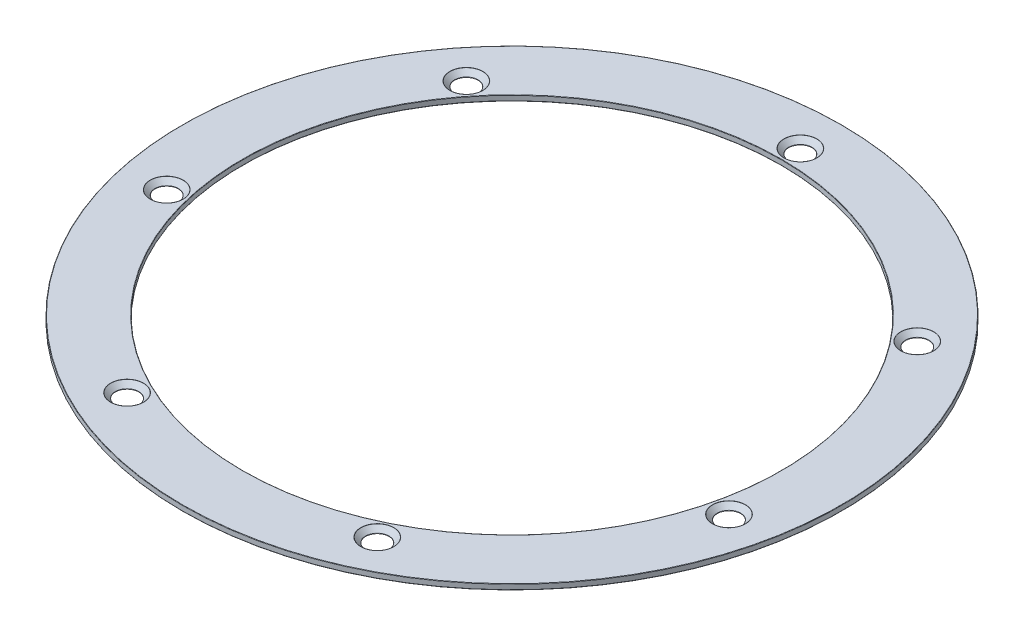
ISO-10303-21;
HEADER;
FILE_DESCRIPTION(('STEP AP214'),'2;1');
FILE_NAME('part.step','',(''),(''),'','','');
FILE_SCHEMA(('AUTOMOTIVE_DESIGN { 1 0 10303 214 1 1 1 1 }'));
ENDSEC;
DATA;
#1=APPLICATION_CONTEXT('core data for automotive mechanical design processes');
#2=APPLICATION_PROTOCOL_DEFINITION('international standard','automotive_design',2000,#1);
#3=PRODUCT_CONTEXT('',#1,'mechanical');
#4=PRODUCT('Part','Part','',(#3));
#5=PRODUCT_RELATED_PRODUCT_CATEGORY('part','',(#4));
#6=PRODUCT_DEFINITION_FORMATION('','',#4);
#7=PRODUCT_DEFINITION_CONTEXT('part definition',#1,'design');
#8=PRODUCT_DEFINITION('design','',#6,#7);
#9=PRODUCT_DEFINITION_SHAPE('','',#8);
#10=(LENGTH_UNIT() NAMED_UNIT(*) SI_UNIT(.MILLI.,.METRE.));
#11=(NAMED_UNIT(*) PLANE_ANGLE_UNIT() SI_UNIT($,.RADIAN.));
#12=(NAMED_UNIT(*) SI_UNIT($,.STERADIAN.) SOLID_ANGLE_UNIT());
#13=UNCERTAINTY_MEASURE_WITH_UNIT(LENGTH_MEASURE(1.E-05),#10,'distance_accuracy_value','');
#14=(GEOMETRIC_REPRESENTATION_CONTEXT(3) GLOBAL_UNCERTAINTY_ASSIGNED_CONTEXT((#13)) GLOBAL_UNIT_ASSIGNED_CONTEXT((#10,
#11,#12)) REPRESENTATION_CONTEXT('',''));
#15=CARTESIAN_POINT('',(0.,0.,0.));
#16=DIRECTION('',(0.,0.,1.));
#17=DIRECTION('',(1.,0.,0.));
#18=AXIS2_PLACEMENT_3D('',#15,#16,#17);
#19=CARTESIAN_POINT('',(0.,0.,0.));
#20=DIRECTION('',(0.,1.,0.));
#21=DIRECTION('',(0.,0.,1.));
#22=AXIS2_PLACEMENT_3D('',#19,#20,#21);
#23=PLANE('',#22);
#24=CARTESIAN_POINT('',(0.,0.,0.));
#25=DIRECTION('',(0.,1.,0.));
#26=DIRECTION('',(0.,0.,1.));
#27=AXIS2_PLACEMENT_3D('',#24,#25,#26);
#28=CIRCLE('',#27,75.3);
#29=CARTESIAN_POINT('',(0.,0.,75.3));
#30=VERTEX_POINT('',#29);
#31=EDGE_CURVE('E169',#30,#30,#28,.T.);
#32=ORIENTED_EDGE('',*,*,#31,.T.);
#33=EDGE_LOOP('',(#32));
#34=FACE_BOUND('',#33,.T.);
#35=CARTESIAN_POINT('',(0.,0.,0.));
#36=DIRECTION('',(0.,1.,0.));
#37=DIRECTION('',(0.,0.,1.));
#38=AXIS2_PLACEMENT_3D('',#35,#36,#37);
#39=CIRCLE('',#38,91.9);
#40=CARTESIAN_POINT('',(0.,0.,91.9));
#41=VERTEX_POINT('',#40);
#42=EDGE_CURVE('E173',#41,#41,#39,.F.);
#43=ORIENTED_EDGE('',*,*,#42,.T.);
#44=EDGE_LOOP('',(#43));
#45=FACE_BOUND('',#44,.T.);
#46=CARTESIAN_POINT('',(0.,0.,-80.5));
#47=DIRECTION('',(0.,1.,0.));
#48=DIRECTION('',(0.,0.,1.));
#49=AXIS2_PLACEMENT_3D('',#46,#47,#48);
#50=CIRCLE('',#49,3.33142135623731);
#51=CARTESIAN_POINT('',(0.,0.,-77.1685786437627));
#52=VERTEX_POINT('',#51);
#53=EDGE_CURVE('E177',#52,#52,#50,.T.);
#54=ORIENTED_EDGE('',*,*,#53,.T.);
#55=EDGE_LOOP('',(#54));
#56=FACE_BOUND('',#55,.T.);
#57=CARTESIAN_POINT('',(-62.9374343386765,0.,-50.1909290496279));
#58=DIRECTION('',(0.,1.,0.));
#59=DIRECTION('',(0.,0.,1.));
#60=AXIS2_PLACEMENT_3D('',#57,#58,#59);
#61=CIRCLE('',#60,3.33142135623731);
#62=CARTESIAN_POINT('',(-62.9374343386765,0.,-46.8595076933906));
#63=VERTEX_POINT('',#62);
#64=EDGE_CURVE('E181',#63,#63,#61,.T.);
#65=ORIENTED_EDGE('',*,*,#64,.T.);
#66=EDGE_LOOP('',(#65));
#67=FACE_BOUND('',#66,.T.);
#68=CARTESIAN_POINT('',(-78.4816969306367,0.,17.9129351834836));
#69=DIRECTION('',(0.,1.,0.));
#70=DIRECTION('',(0.,0.,1.));
#71=AXIS2_PLACEMENT_3D('',#68,#69,#70);
#72=CIRCLE('',#71,3.33142135623731);
#73=CARTESIAN_POINT('',(-78.4816969306367,0.,21.2443565397209));
#74=VERTEX_POINT('',#73);
#75=EDGE_CURVE('E185',#74,#74,#72,.T.);
#76=ORIENTED_EDGE('',*,*,#75,.T.);
#77=EDGE_LOOP('',(#76));
#78=FACE_BOUND('',#77,.T.);
#79=CARTESIAN_POINT('',(-34.927640998963,0.,72.527993866145));
#80=DIRECTION('',(0.,1.,0.));
#81=DIRECTION('',(0.,0.,1.));
#82=AXIS2_PLACEMENT_3D('',#79,#80,#81);
#83=CIRCLE('',#82,3.33142135623731);
#84=CARTESIAN_POINT('',(-34.927640998963,0.,75.8594152223823));
#85=VERTEX_POINT('',#84);
#86=EDGE_CURVE('E189',#85,#85,#83,.T.);
#87=ORIENTED_EDGE('',*,*,#86,.T.);
#88=EDGE_LOOP('',(#87));
#89=FACE_BOUND('',#88,.T.);
#90=CARTESIAN_POINT('',(34.927640998964,0.,72.5279938661445));
#91=DIRECTION('',(0.,1.,0.));
#92=DIRECTION('',(0.,0.,1.));
#93=AXIS2_PLACEMENT_3D('',#90,#91,#92);
#94=CIRCLE('',#93,3.33142135623731);
#95=CARTESIAN_POINT('',(34.927640998964,0.,75.8594152223818));
#96=VERTEX_POINT('',#95);
#97=EDGE_CURVE('E193',#96,#96,#94,.T.);
#98=ORIENTED_EDGE('',*,*,#97,.T.);
#99=EDGE_LOOP('',(#98));
#100=FACE_BOUND('',#99,.T.);
#101=CARTESIAN_POINT('',(78.481696930637,0.,17.9129351834826));
#102=DIRECTION('',(0.,1.,0.));
#103=DIRECTION('',(0.,0.,1.));
#104=AXIS2_PLACEMENT_3D('',#101,#102,#103);
#105=CIRCLE('',#104,3.33142135623731);
#106=CARTESIAN_POINT('',(78.481696930637,0.,21.2443565397199));
#107=VERTEX_POINT('',#106);
#108=EDGE_CURVE('E197',#107,#107,#105,.T.);
#109=ORIENTED_EDGE('',*,*,#108,.T.);
#110=EDGE_LOOP('',(#109));
#111=FACE_BOUND('',#110,.T.);
#112=CARTESIAN_POINT('',(62.9374343386758,0.,-50.1909290496288));
#113=DIRECTION('',(0.,1.,0.));
#114=DIRECTION('',(0.,0.,1.));
#115=AXIS2_PLACEMENT_3D('',#112,#113,#114);
#116=CIRCLE('',#115,3.33142135623731);
#117=CARTESIAN_POINT('',(62.9374343386758,0.,-46.8595076933915));
#118=VERTEX_POINT('',#117);
#119=EDGE_CURVE('E201',#118,#118,#116,.T.);
#120=ORIENTED_EDGE('',*,*,#119,.T.);
#121=EDGE_LOOP('',(#120));
#122=FACE_BOUND('',#121,.T.);
#123=ADVANCED_FACE('F51',(#34,#45,#56,#67,#78,#89,#100,#111,#122),#23,.F.);
#124=CARTESIAN_POINT('',(0.,1.5,0.));
#125=DIRECTION('',(0.,1.,0.));
#126=DIRECTION('',(0.,0.,1.));
#127=AXIS2_PLACEMENT_3D('',#124,#125,#126);
#128=PLANE('',#127);
#129=CARTESIAN_POINT('',(0.,1.5,0.));
#130=DIRECTION('',(0.,1.,0.));
#131=DIRECTION('',(0.,0.,1.));
#132=AXIS2_PLACEMENT_3D('',#129,#130,#131);
#133=CIRCLE('',#132,75.3);
#134=CARTESIAN_POINT('',(0.,1.5,75.3));
#135=VERTEX_POINT('',#134);
#136=EDGE_CURVE('E10',#135,#135,#133,.F.);
#137=ORIENTED_EDGE('',*,*,#136,.T.);
#138=EDGE_LOOP('',(#137));
#139=FACE_BOUND('',#138,.T.);
#140=CARTESIAN_POINT('',(0.,1.5,0.));
#141=DIRECTION('',(0.,1.,0.));
#142=DIRECTION('',(0.,0.,1.));
#143=AXIS2_PLACEMENT_3D('',#140,#141,#142);
#144=CIRCLE('',#143,91.9);
#145=CARTESIAN_POINT('',(0.,1.5,91.9));
#146=VERTEX_POINT('',#145);
#147=EDGE_CURVE('E59',#146,#146,#144,.T.);
#148=ORIENTED_EDGE('',*,*,#147,.T.);
#149=EDGE_LOOP('',(#148));
#150=FACE_BOUND('',#149,.T.);
#151=CARTESIAN_POINT('',(0.,1.5,-80.5));
#152=DIRECTION('',(0.,1.,0.));
#153=DIRECTION('',(0.,0.,1.));
#154=AXIS2_PLACEMENT_3D('',#151,#152,#153);
#155=CIRCLE('',#154,4.63142135623731);
#156=CARTESIAN_POINT('',(0.,1.5,-75.8685786437627));
#157=VERTEX_POINT('',#156);
#158=EDGE_CURVE('E65',#157,#157,#155,.F.);
#159=ORIENTED_EDGE('',*,*,#158,.T.);
#160=EDGE_LOOP('',(#159));
#161=FACE_BOUND('',#160,.T.);
#162=CARTESIAN_POINT('',(-62.9374343386765,1.5,-50.1909290496279));
#163=DIRECTION('',(0.,1.,0.));
#164=DIRECTION('',(0.,0.,1.));
#165=AXIS2_PLACEMENT_3D('',#162,#163,#164);
#166=CIRCLE('',#165,4.63142135623731);
#167=CARTESIAN_POINT('',(-62.9374343386765,1.5,-45.5595076933906));
#168=VERTEX_POINT('',#167);
#169=EDGE_CURVE('E71',#168,#168,#166,.F.);
#170=ORIENTED_EDGE('',*,*,#169,.T.);
#171=EDGE_LOOP('',(#170));
#172=FACE_BOUND('',#171,.T.);
#173=CARTESIAN_POINT('',(-78.4816969306367,1.5,17.9129351834836));
#174=DIRECTION('',(0.,1.,0.));
#175=DIRECTION('',(0.,0.,1.));
#176=AXIS2_PLACEMENT_3D('',#173,#174,#175);
#177=CIRCLE('',#176,4.63142135623731);
#178=CARTESIAN_POINT('',(-78.4816969306367,1.5,22.5443565397209));
#179=VERTEX_POINT('',#178);
#180=EDGE_CURVE('E77',#179,#179,#177,.F.);
#181=ORIENTED_EDGE('',*,*,#180,.T.);
#182=EDGE_LOOP('',(#181));
#183=FACE_BOUND('',#182,.T.);
#184=CARTESIAN_POINT('',(-34.927640998963,1.5,72.527993866145));
#185=DIRECTION('',(0.,1.,0.));
#186=DIRECTION('',(0.,0.,1.));
#187=AXIS2_PLACEMENT_3D('',#184,#185,#186);
#188=CIRCLE('',#187,4.63142135623731);
#189=CARTESIAN_POINT('',(-34.927640998963,1.5,77.1594152223823));
#190=VERTEX_POINT('',#189);
#191=EDGE_CURVE('E81',#190,#190,#188,.F.);
#192=ORIENTED_EDGE('',*,*,#191,.T.);
#193=EDGE_LOOP('',(#192));
#194=FACE_BOUND('',#193,.T.);
#195=CARTESIAN_POINT('',(34.927640998964,1.5,72.5279938661445));
#196=DIRECTION('',(0.,1.,0.));
#197=DIRECTION('',(0.,0.,1.));
#198=AXIS2_PLACEMENT_3D('',#195,#196,#197);
#199=CIRCLE('',#198,4.63142135623731);
#200=CARTESIAN_POINT('',(34.927640998964,1.5,77.1594152223818));
#201=VERTEX_POINT('',#200);
#202=EDGE_CURVE('E85',#201,#201,#199,.F.);
#203=ORIENTED_EDGE('',*,*,#202,.T.);
#204=EDGE_LOOP('',(#203));
#205=FACE_BOUND('',#204,.T.);
#206=CARTESIAN_POINT('',(78.481696930637,1.5,17.9129351834826));
#207=DIRECTION('',(0.,1.,0.));
#208=DIRECTION('',(0.,0.,1.));
#209=AXIS2_PLACEMENT_3D('',#206,#207,#208);
#210=CIRCLE('',#209,4.63142135623731);
#211=CARTESIAN_POINT('',(78.481696930637,1.5,22.5443565397199));
#212=VERTEX_POINT('',#211);
#213=EDGE_CURVE('E89',#212,#212,#210,.F.);
#214=ORIENTED_EDGE('',*,*,#213,.T.);
#215=EDGE_LOOP('',(#214));
#216=FACE_BOUND('',#215,.T.);
#217=CARTESIAN_POINT('',(62.9374343386758,1.5,-50.1909290496288));
#218=DIRECTION('',(0.,1.,0.));
#219=DIRECTION('',(0.,0.,1.));
#220=AXIS2_PLACEMENT_3D('',#217,#218,#219);
#221=CIRCLE('',#220,4.63142135623731);
#222=CARTESIAN_POINT('',(62.9374343386758,1.5,-45.5595076933915));
#223=VERTEX_POINT('',#222);
#224=EDGE_CURVE('E93',#223,#223,#221,.F.);
#225=ORIENTED_EDGE('',*,*,#224,.T.);
#226=EDGE_LOOP('',(#225));
#227=FACE_BOUND('',#226,.T.);
#228=ADVANCED_FACE('F226',(#139,#150,#161,#172,#183,#194,#205,#216,#227),#128,.T.);
#229=CARTESIAN_POINT('',(0.,1.5,0.));
#230=DIRECTION('',(0.,-1.,0.));
#231=DIRECTION('',(0.,0.,-1.));
#232=AXIS2_PLACEMENT_3D('',#229,#230,#231);
#233=CYLINDRICAL_SURFACE('',#232,92.);
#234=CARTESIAN_POINT('',(0.,0.1,0.));
#235=DIRECTION('',(0.,1.,0.));
#236=DIRECTION('',(0.,0.,1.));
#237=AXIS2_PLACEMENT_3D('',#234,#235,#236);
#238=CIRCLE('',#237,92.);
#239=CARTESIAN_POINT('',(0.,0.1,92.));
#240=VERTEX_POINT('',#239);
#241=EDGE_CURVE('E153',#240,#240,#238,.T.);
#242=ORIENTED_EDGE('',*,*,#241,.T.);
#243=EDGE_LOOP('',(#242));
#244=FACE_BOUND('',#243,.T.);
#245=CARTESIAN_POINT('',(0.,1.4,0.));
#246=DIRECTION('',(0.,1.,0.));
#247=DIRECTION('',(0.,0.,1.));
#248=AXIS2_PLACEMENT_3D('',#245,#246,#247);
#249=CIRCLE('',#248,92.);
#250=CARTESIAN_POINT('',(0.,1.4,92.));
#251=VERTEX_POINT('',#250);
#252=EDGE_CURVE('E157',#251,#251,#249,.F.);
#253=ORIENTED_EDGE('',*,*,#252,.T.);
#254=EDGE_LOOP('',(#253));
#255=FACE_BOUND('',#254,.T.);
#256=ADVANCED_FACE('F232',(#244,#255),#233,.T.);
#257=CARTESIAN_POINT('',(0.,1.5,0.));
#258=DIRECTION('',(0.,-1.,0.));
#259=DIRECTION('',(0.,0.,-1.));
#260=AXIS2_PLACEMENT_3D('',#257,#258,#259);
#261=CYLINDRICAL_SURFACE('',#260,75.2);
#262=CARTESIAN_POINT('',(0.,0.1,0.));
#263=DIRECTION('',(0.,1.,0.));
#264=DIRECTION('',(0.,0.,1.));
#265=AXIS2_PLACEMENT_3D('',#262,#263,#264);
#266=CIRCLE('',#265,75.2);
#267=CARTESIAN_POINT('',(0.,0.1,75.2));
#268=VERTEX_POINT('',#267);
#269=EDGE_CURVE('E161',#268,#268,#266,.F.);
#270=ORIENTED_EDGE('',*,*,#269,.T.);
#271=EDGE_LOOP('',(#270));
#272=FACE_BOUND('',#271,.T.);
#273=CARTESIAN_POINT('',(0.,1.4,0.));
#274=DIRECTION('',(0.,1.,0.));
#275=DIRECTION('',(0.,0.,1.));
#276=AXIS2_PLACEMENT_3D('',#273,#274,#275);
#277=CIRCLE('',#276,75.2);
#278=CARTESIAN_POINT('',(0.,1.4,75.2));
#279=VERTEX_POINT('',#278);
#280=EDGE_CURVE('E165',#279,#279,#277,.T.);
#281=ORIENTED_EDGE('',*,*,#280,.T.);
#282=EDGE_LOOP('',(#281));
#283=FACE_BOUND('',#282,.T.);
#284=ADVANCED_FACE('F239',(#272,#283),#261,.F.);
#285=CARTESIAN_POINT('',(0.,1.5,-80.5));
#286=DIRECTION('',(0.,1.,0.));
#287=DIRECTION('',(0.,0.,1.));
#288=AXIS2_PLACEMENT_3D('',#285,#286,#287);
#289=CONICAL_SURFACE('',#288,4.59,0.785398163397449);
#290=CARTESIAN_POINT('',(0.,0.170710678118655,-80.5));
#291=DIRECTION('',(0.,-1.,0.));
#292=DIRECTION('',(0.,0.,-1.));
#293=AXIS2_PLACEMENT_3D('',#290,#291,#292);
#294=CIRCLE('',#293,3.26071067811865);
#295=CARTESIAN_POINT('',(0.,0.170710678118655,-83.7607106781187));
#296=VERTEX_POINT('',#295);
#297=EDGE_CURVE('E145',#296,#296,#294,.T.);
#298=ORIENTED_EDGE('',*,*,#297,.T.);
#299=EDGE_LOOP('',(#298));
#300=FACE_BOUND('',#299,.T.);
#301=CARTESIAN_POINT('',(0.,1.47071067811865,-80.5));
#302=DIRECTION('',(0.,1.,0.));
#303=DIRECTION('',(0.,0.,1.));
#304=AXIS2_PLACEMENT_3D('',#301,#302,#303);
#305=CIRCLE('',#304,4.56071067811865);
#306=CARTESIAN_POINT('',(0.,1.47071067811865,-75.9392893218813));
#307=VERTEX_POINT('',#306);
#308=EDGE_CURVE('E149',#307,#307,#305,.T.);
#309=ORIENTED_EDGE('',*,*,#308,.T.);
#310=EDGE_LOOP('',(#309));
#311=FACE_BOUND('',#310,.T.);
#312=ADVANCED_FACE('F381',(#300,#311),#289,.F.);
#313=CARTESIAN_POINT('',(-62.9374343386765,1.5,-50.1909290496279));
#314=DIRECTION('',(0.,1.,0.));
#315=DIRECTION('',(0.781831482468031,0.,0.623489801858732));
#316=AXIS2_PLACEMENT_3D('',#313,#314,#315);
#317=CONICAL_SURFACE('',#316,4.59,0.785398163397449);
#318=CARTESIAN_POINT('',(-62.9374343386765,0.170710678118655,-50.1909290496279));
#319=DIRECTION('',(0.,-1.,0.));
#320=DIRECTION('',(0.,0.,-1.));
#321=AXIS2_PLACEMENT_3D('',#318,#319,#320);
#322=CIRCLE('',#321,3.26071067811865);
#323=CARTESIAN_POINT('',(-62.9374343386765,0.170710678118655,-53.4516397277466));
#324=VERTEX_POINT('',#323);
#325=EDGE_CURVE('E137',#324,#324,#322,.T.);
#326=ORIENTED_EDGE('',*,*,#325,.T.);
#327=EDGE_LOOP('',(#326));
#328=FACE_BOUND('',#327,.T.);
#329=CARTESIAN_POINT('',(-62.9374343386765,1.47071067811865,-50.1909290496279));
#330=DIRECTION('',(0.,1.,0.));
#331=DIRECTION('',(0.,0.,1.));
#332=AXIS2_PLACEMENT_3D('',#329,#330,#331);
#333=CIRCLE('',#332,4.56071067811865);
#334=CARTESIAN_POINT('',(-62.9374343386765,1.47071067811865,-45.6302183715093));
#335=VERTEX_POINT('',#334);
#336=EDGE_CURVE('E141',#335,#335,#333,.T.);
#337=ORIENTED_EDGE('',*,*,#336,.T.);
#338=EDGE_LOOP('',(#337));
#339=FACE_BOUND('',#338,.T.);
#340=ADVANCED_FACE('F377',(#328,#339),#317,.F.);
#341=CARTESIAN_POINT('',(-78.4816969306367,1.5,17.9129351834836));
#342=DIRECTION('',(0.,1.,0.));
#343=DIRECTION('',(0.974927912181823,0.,-0.222520933956318));
#344=AXIS2_PLACEMENT_3D('',#341,#342,#343);
#345=CONICAL_SURFACE('',#344,4.59,0.785398163397449);
#346=CARTESIAN_POINT('',(-78.4816969306367,0.170710678118655,17.9129351834836));
#347=DIRECTION('',(0.,-1.,0.));
#348=DIRECTION('',(0.,0.,-1.));
#349=AXIS2_PLACEMENT_3D('',#346,#347,#348);
#350=CIRCLE('',#349,3.26071067811865);
#351=CARTESIAN_POINT('',(-78.4816969306367,0.170710678118655,14.652224505365));
#352=VERTEX_POINT('',#351);
#353=EDGE_CURVE('E129',#352,#352,#350,.T.);
#354=ORIENTED_EDGE('',*,*,#353,.T.);
#355=EDGE_LOOP('',(#354));
#356=FACE_BOUND('',#355,.T.);
#357=CARTESIAN_POINT('',(-78.4816969306367,1.47071067811865,17.9129351834836));
#358=DIRECTION('',(0.,1.,0.));
#359=DIRECTION('',(0.,0.,1.));
#360=AXIS2_PLACEMENT_3D('',#357,#358,#359);
#361=CIRCLE('',#360,4.56071067811865);
#362=CARTESIAN_POINT('',(-78.4816969306367,1.47071067811865,22.4736458616023));
#363=VERTEX_POINT('',#362);
#364=EDGE_CURVE('E133',#363,#363,#361,.T.);
#365=ORIENTED_EDGE('',*,*,#364,.T.);
#366=EDGE_LOOP('',(#365));
#367=FACE_BOUND('',#366,.T.);
#368=ADVANCED_FACE('F380',(#356,#367),#345,.F.);
#369=CARTESIAN_POINT('',(-34.927640998963,1.5,72.527993866145));
#370=DIRECTION('',(0.,1.,0.));
#371=DIRECTION('',(0.433883739117553,0.,-0.900968867902422));
#372=AXIS2_PLACEMENT_3D('',#369,#370,#371);
#373=CONICAL_SURFACE('',#372,4.59,0.785398163397449);
#374=CARTESIAN_POINT('',(-34.927640998963,0.170710678118655,72.527993866145));
#375=DIRECTION('',(0.,-1.,0.));
#376=DIRECTION('',(0.,0.,-1.));
#377=AXIS2_PLACEMENT_3D('',#374,#375,#376);
#378=CIRCLE('',#377,3.26071067811865);
#379=CARTESIAN_POINT('',(-34.927640998963,0.170710678118655,69.2672831880263));
#380=VERTEX_POINT('',#379);
#381=EDGE_CURVE('E121',#380,#380,#378,.T.);
#382=ORIENTED_EDGE('',*,*,#381,.T.);
#383=EDGE_LOOP('',(#382));
#384=FACE_BOUND('',#383,.T.);
#385=CARTESIAN_POINT('',(-34.927640998963,1.47071067811865,72.527993866145));
#386=DIRECTION('',(0.,1.,0.));
#387=DIRECTION('',(0.,0.,1.));
#388=AXIS2_PLACEMENT_3D('',#385,#386,#387);
#389=CIRCLE('',#388,4.56071067811865);
#390=CARTESIAN_POINT('',(-34.927640998963,1.47071067811865,77.0887045442636));
#391=VERTEX_POINT('',#390);
#392=EDGE_CURVE('E125',#391,#391,#389,.T.);
#393=ORIENTED_EDGE('',*,*,#392,.T.);
#394=EDGE_LOOP('',(#393));
#395=FACE_BOUND('',#394,.T.);
#396=ADVANCED_FACE('F282',(#384,#395),#373,.F.);
#397=CARTESIAN_POINT('',(34.927640998964,1.5,72.5279938661445));
#398=DIRECTION('',(0.,1.,0.));
#399=DIRECTION('',(-0.433883739117565,0.,-0.900968867902416));
#400=AXIS2_PLACEMENT_3D('',#397,#398,#399);
#401=CONICAL_SURFACE('',#400,4.59,0.785398163397449);
#402=CARTESIAN_POINT('',(34.927640998964,0.170710678118655,72.5279938661445));
#403=DIRECTION('',(0.,-1.,0.));
#404=DIRECTION('',(0.,0.,-1.));
#405=AXIS2_PLACEMENT_3D('',#402,#403,#404);
#406=CIRCLE('',#405,3.26071067811865);
#407=CARTESIAN_POINT('',(34.927640998964,0.170710678118655,69.2672831880258));
#408=VERTEX_POINT('',#407);
#409=EDGE_CURVE('E113',#408,#408,#406,.T.);
#410=ORIENTED_EDGE('',*,*,#409,.T.);
#411=EDGE_LOOP('',(#410));
#412=FACE_BOUND('',#411,.T.);
#413=CARTESIAN_POINT('',(34.927640998964,1.47071067811865,72.5279938661445));
#414=DIRECTION('',(0.,1.,0.));
#415=DIRECTION('',(0.,0.,1.));
#416=AXIS2_PLACEMENT_3D('',#413,#414,#415);
#417=CIRCLE('',#416,4.56071067811865);
#418=CARTESIAN_POINT('',(34.927640998964,1.47071067811865,77.0887045442631));
#419=VERTEX_POINT('',#418);
#420=EDGE_CURVE('E117',#419,#419,#417,.T.);
#421=ORIENTED_EDGE('',*,*,#420,.T.);
#422=EDGE_LOOP('',(#421));
#423=FACE_BOUND('',#422,.T.);
#424=ADVANCED_FACE('F278',(#412,#423),#401,.F.);
#425=CARTESIAN_POINT('',(78.481696930637,1.5,17.9129351834826));
#426=DIRECTION('',(0.,1.,0.));
#427=DIRECTION('',(-0.974927912181826,0.,-0.222520933956305));
#428=AXIS2_PLACEMENT_3D('',#425,#426,#427);
#429=CONICAL_SURFACE('',#428,4.59,0.785398163397449);
#430=CARTESIAN_POINT('',(78.481696930637,0.170710678118655,17.9129351834826));
#431=DIRECTION('',(0.,-1.,0.));
#432=DIRECTION('',(0.,0.,-1.));
#433=AXIS2_PLACEMENT_3D('',#430,#431,#432);
#434=CIRCLE('',#433,3.26071067811865);
#435=CARTESIAN_POINT('',(78.481696930637,0.170710678118655,14.6522245053639));
#436=VERTEX_POINT('',#435);
#437=EDGE_CURVE('E105',#436,#436,#434,.T.);
#438=ORIENTED_EDGE('',*,*,#437,.T.);
#439=EDGE_LOOP('',(#438));
#440=FACE_BOUND('',#439,.T.);
#441=CARTESIAN_POINT('',(78.481696930637,1.47071067811865,17.9129351834826));
#442=DIRECTION('',(0.,1.,0.));
#443=DIRECTION('',(0.,0.,1.));
#444=AXIS2_PLACEMENT_3D('',#441,#442,#443);
#445=CIRCLE('',#444,4.56071067811865);
#446=CARTESIAN_POINT('',(78.481696930637,1.47071067811865,22.4736458616012));
#447=VERTEX_POINT('',#446);
#448=EDGE_CURVE('E109',#447,#447,#445,.T.);
#449=ORIENTED_EDGE('',*,*,#448,.T.);
#450=EDGE_LOOP('',(#449));
#451=FACE_BOUND('',#450,.T.);
#452=ADVANCED_FACE('F281',(#440,#451),#429,.F.);
#453=CARTESIAN_POINT('',(62.9374343386758,1.5,-50.1909290496288));
#454=DIRECTION('',(0.,1.,0.));
#455=DIRECTION('',(-0.781831482468022,0.,0.623489801858743));
#456=AXIS2_PLACEMENT_3D('',#453,#454,#455);
#457=CONICAL_SURFACE('',#456,4.59,0.785398163397449);
#458=CARTESIAN_POINT('',(62.9374343386758,0.170710678118655,-50.1909290496288));
#459=DIRECTION('',(0.,-1.,0.));
#460=DIRECTION('',(0.,0.,-1.));
#461=AXIS2_PLACEMENT_3D('',#458,#459,#460);
#462=CIRCLE('',#461,3.26071067811865);
#463=CARTESIAN_POINT('',(62.9374343386758,0.170710678118655,-53.4516397277475));
#464=VERTEX_POINT('',#463);
#465=EDGE_CURVE('E97',#464,#464,#462,.T.);
#466=ORIENTED_EDGE('',*,*,#465,.T.);
#467=EDGE_LOOP('',(#466));
#468=FACE_BOUND('',#467,.T.);
#469=CARTESIAN_POINT('',(62.9374343386758,1.47071067811865,-50.1909290496288));
#470=DIRECTION('',(0.,1.,0.));
#471=DIRECTION('',(0.,0.,1.));
#472=AXIS2_PLACEMENT_3D('',#469,#470,#471);
#473=CIRCLE('',#472,4.56071067811865);
#474=CARTESIAN_POINT('',(62.9374343386758,1.47071067811865,-45.6302183715102));
#475=VERTEX_POINT('',#474);
#476=EDGE_CURVE('E101',#475,#475,#473,.T.);
#477=ORIENTED_EDGE('',*,*,#476,.T.);
#478=EDGE_LOOP('',(#477));
#479=FACE_BOUND('',#478,.T.);
#480=ADVANCED_FACE('F245',(#468,#479),#457,.F.);
#481=CARTESIAN_POINT('',(0.,0.1,0.));
#482=DIRECTION('',(0.,1.,0.));
#483=DIRECTION('',(0.,0.,1.));
#484=AXIS2_PLACEMENT_3D('',#481,#482,#483);
#485=TOROIDAL_SURFACE('',#484,75.3,0.1);
#486=ORIENTED_EDGE('',*,*,#269,.F.);
#487=EDGE_LOOP('',(#486));
#488=FACE_BOUND('',#487,.T.);
#489=ORIENTED_EDGE('',*,*,#31,.F.);
#490=EDGE_LOOP('',(#489));
#491=FACE_BOUND('',#490,.T.);
#492=ADVANCED_FACE('F241',(#488,#491),#485,.T.);
#493=CARTESIAN_POINT('',(0.,0.1,0.));
#494=DIRECTION('',(0.,1.,0.));
#495=DIRECTION('',(0.,0.,1.));
#496=AXIS2_PLACEMENT_3D('',#493,#494,#495);
#497=TOROIDAL_SURFACE('',#496,91.9,0.1);
#498=ORIENTED_EDGE('',*,*,#42,.F.);
#499=EDGE_LOOP('',(#498));
#500=FACE_BOUND('',#499,.T.);
#501=ORIENTED_EDGE('',*,*,#241,.F.);
#502=EDGE_LOOP('',(#501));
#503=FACE_BOUND('',#502,.T.);
#504=ADVANCED_FACE('F244',(#500,#503),#497,.T.);
#505=CARTESIAN_POINT('',(0.,0.1,-80.5));
#506=DIRECTION('',(0.,1.,0.));
#507=DIRECTION('',(0.,0.,1.));
#508=AXIS2_PLACEMENT_3D('',#505,#506,#507);
#509=TOROIDAL_SURFACE('',#508,3.33142135623731,0.1);
#510=ORIENTED_EDGE('',*,*,#297,.F.);
#511=EDGE_LOOP('',(#510));
#512=FACE_BOUND('',#511,.T.);
#513=ORIENTED_EDGE('',*,*,#53,.F.);
#514=EDGE_LOOP('',(#513));
#515=FACE_BOUND('',#514,.T.);
#516=ADVANCED_FACE('F249',(#512,#515),#509,.T.);
#517=CARTESIAN_POINT('',(-62.9374343386765,0.1,-50.1909290496279));
#518=DIRECTION('',(0.,1.,0.));
#519=DIRECTION('',(0.,0.,1.));
#520=AXIS2_PLACEMENT_3D('',#517,#518,#519);
#521=TOROIDAL_SURFACE('',#520,3.33142135623731,0.1);
#522=ORIENTED_EDGE('',*,*,#325,.F.);
#523=EDGE_LOOP('',(#522));
#524=FACE_BOUND('',#523,.T.);
#525=ORIENTED_EDGE('',*,*,#64,.F.);
#526=EDGE_LOOP('',(#525));
#527=FACE_BOUND('',#526,.T.);
#528=ADVANCED_FACE('F253',(#524,#527),#521,.T.);
#529=CARTESIAN_POINT('',(-78.4816969306367,0.1,17.9129351834836));
#530=DIRECTION('',(0.,1.,0.));
#531=DIRECTION('',(0.,0.,1.));
#532=AXIS2_PLACEMENT_3D('',#529,#530,#531);
#533=TOROIDAL_SURFACE('',#532,3.33142135623731,0.1);
#534=ORIENTED_EDGE('',*,*,#353,.F.);
#535=EDGE_LOOP('',(#534));
#536=FACE_BOUND('',#535,.T.);
#537=ORIENTED_EDGE('',*,*,#75,.F.);
#538=EDGE_LOOP('',(#537));
#539=FACE_BOUND('',#538,.T.);
#540=ADVANCED_FACE('F257',(#536,#539),#533,.T.);
#541=CARTESIAN_POINT('',(-34.927640998963,0.1,72.527993866145));
#542=DIRECTION('',(0.,1.,0.));
#543=DIRECTION('',(0.,0.,1.));
#544=AXIS2_PLACEMENT_3D('',#541,#542,#543);
#545=TOROIDAL_SURFACE('',#544,3.33142135623731,0.1);
#546=ORIENTED_EDGE('',*,*,#381,.F.);
#547=EDGE_LOOP('',(#546));
#548=FACE_BOUND('',#547,.T.);
#549=ORIENTED_EDGE('',*,*,#86,.F.);
#550=EDGE_LOOP('',(#549));
#551=FACE_BOUND('',#550,.T.);
#552=ADVANCED_FACE('F261',(#548,#551),#545,.T.);
#553=CARTESIAN_POINT('',(34.927640998964,0.1,72.5279938661445));
#554=DIRECTION('',(0.,1.,0.));
#555=DIRECTION('',(0.,0.,1.));
#556=AXIS2_PLACEMENT_3D('',#553,#554,#555);
#557=TOROIDAL_SURFACE('',#556,3.33142135623731,0.1);
#558=ORIENTED_EDGE('',*,*,#409,.F.);
#559=EDGE_LOOP('',(#558));
#560=FACE_BOUND('',#559,.T.);
#561=ORIENTED_EDGE('',*,*,#97,.F.);
#562=EDGE_LOOP('',(#561));
#563=FACE_BOUND('',#562,.T.);
#564=ADVANCED_FACE('F221',(#560,#563),#557,.T.);
#565=CARTESIAN_POINT('',(78.481696930637,0.1,17.9129351834826));
#566=DIRECTION('',(0.,1.,0.));
#567=DIRECTION('',(0.,0.,1.));
#568=AXIS2_PLACEMENT_3D('',#565,#566,#567);
#569=TOROIDAL_SURFACE('',#568,3.33142135623731,0.1);
#570=ORIENTED_EDGE('',*,*,#437,.F.);
#571=EDGE_LOOP('',(#570));
#572=FACE_BOUND('',#571,.T.);
#573=ORIENTED_EDGE('',*,*,#108,.F.);
#574=EDGE_LOOP('',(#573));
#575=FACE_BOUND('',#574,.T.);
#576=ADVANCED_FACE('F211',(#572,#575),#569,.T.);
#577=CARTESIAN_POINT('',(62.9374343386758,0.1,-50.1909290496288));
#578=DIRECTION('',(0.,1.,0.));
#579=DIRECTION('',(0.,0.,1.));
#580=AXIS2_PLACEMENT_3D('',#577,#578,#579);
#581=TOROIDAL_SURFACE('',#580,3.33142135623731,0.1);
#582=ORIENTED_EDGE('',*,*,#465,.F.);
#583=EDGE_LOOP('',(#582));
#584=FACE_BOUND('',#583,.T.);
#585=ORIENTED_EDGE('',*,*,#119,.F.);
#586=EDGE_LOOP('',(#585));
#587=FACE_BOUND('',#586,.T.);
#588=ADVANCED_FACE('F208',(#584,#587),#581,.T.);
#589=CARTESIAN_POINT('',(0.,1.4,0.));
#590=DIRECTION('',(0.,1.,0.));
#591=DIRECTION('',(0.,0.,1.));
#592=AXIS2_PLACEMENT_3D('',#589,#590,#591);
#593=TOROIDAL_SURFACE('',#592,75.3,0.1);
#594=ORIENTED_EDGE('',*,*,#136,.F.);
#595=EDGE_LOOP('',(#594));
#596=FACE_BOUND('',#595,.T.);
#597=ORIENTED_EDGE('',*,*,#280,.F.);
#598=EDGE_LOOP('',(#597));
#599=FACE_BOUND('',#598,.T.);
#600=ADVANCED_FACE('F210',(#596,#599),#593,.T.);
#601=CARTESIAN_POINT('',(0.,1.4,0.));
#602=DIRECTION('',(0.,1.,0.));
#603=DIRECTION('',(0.,0.,1.));
#604=AXIS2_PLACEMENT_3D('',#601,#602,#603);
#605=TOROIDAL_SURFACE('',#604,91.9,0.1);
#606=ORIENTED_EDGE('',*,*,#252,.F.);
#607=EDGE_LOOP('',(#606));
#608=FACE_BOUND('',#607,.T.);
#609=ORIENTED_EDGE('',*,*,#147,.F.);
#610=EDGE_LOOP('',(#609));
#611=FACE_BOUND('',#610,.T.);
#612=ADVANCED_FACE('F218',(#608,#611),#605,.T.);
#613=CARTESIAN_POINT('',(0.,1.4,-80.5));
#614=DIRECTION('',(0.,1.,0.));
#615=DIRECTION('',(0.,0.,1.));
#616=AXIS2_PLACEMENT_3D('',#613,#614,#615);
#617=TOROIDAL_SURFACE('',#616,4.63142135623731,0.1);
#618=ORIENTED_EDGE('',*,*,#158,.F.);
#619=EDGE_LOOP('',(#618));
#620=FACE_BOUND('',#619,.T.);
#621=ORIENTED_EDGE('',*,*,#308,.F.);
#622=EDGE_LOOP('',(#621));
#623=FACE_BOUND('',#622,.T.);
#624=ADVANCED_FACE('F308',(#620,#623),#617,.T.);
#625=CARTESIAN_POINT('',(-62.9374343386765,1.4,-50.1909290496279));
#626=DIRECTION('',(0.,1.,0.));
#627=DIRECTION('',(0.,0.,1.));
#628=AXIS2_PLACEMENT_3D('',#625,#626,#627);
#629=TOROIDAL_SURFACE('',#628,4.63142135623731,0.1);
#630=ORIENTED_EDGE('',*,*,#169,.F.);
#631=EDGE_LOOP('',(#630));
#632=FACE_BOUND('',#631,.T.);
#633=ORIENTED_EDGE('',*,*,#336,.F.);
#634=EDGE_LOOP('',(#633));
#635=FACE_BOUND('',#634,.T.);
#636=ADVANCED_FACE('F304',(#632,#635),#629,.T.);
#637=CARTESIAN_POINT('',(-78.4816969306367,1.4,17.9129351834836));
#638=DIRECTION('',(0.,1.,0.));
#639=DIRECTION('',(0.,0.,1.));
#640=AXIS2_PLACEMENT_3D('',#637,#638,#639);
#641=TOROIDAL_SURFACE('',#640,4.63142135623731,0.1);
#642=ORIENTED_EDGE('',*,*,#180,.F.);
#643=EDGE_LOOP('',(#642));
#644=FACE_BOUND('',#643,.T.);
#645=ORIENTED_EDGE('',*,*,#364,.F.);
#646=EDGE_LOOP('',(#645));
#647=FACE_BOUND('',#646,.T.);
#648=ADVANCED_FACE('F297',(#644,#647),#641,.T.);
#649=CARTESIAN_POINT('',(-34.927640998963,1.4,72.527993866145));
#650=DIRECTION('',(0.,1.,0.));
#651=DIRECTION('',(0.,0.,1.));
#652=AXIS2_PLACEMENT_3D('',#649,#650,#651);
#653=TOROIDAL_SURFACE('',#652,4.63142135623731,0.1);
#654=ORIENTED_EDGE('',*,*,#191,.F.);
#655=EDGE_LOOP('',(#654));
#656=FACE_BOUND('',#655,.T.);
#657=ORIENTED_EDGE('',*,*,#392,.F.);
#658=EDGE_LOOP('',(#657));
#659=FACE_BOUND('',#658,.T.);
#660=ADVANCED_FACE('F289',(#656,#659),#653,.T.);
#661=CARTESIAN_POINT('',(34.927640998964,1.4,72.5279938661445));
#662=DIRECTION('',(0.,1.,0.));
#663=DIRECTION('',(0.,0.,1.));
#664=AXIS2_PLACEMENT_3D('',#661,#662,#663);
#665=TOROIDAL_SURFACE('',#664,4.63142135623731,0.1);
#666=ORIENTED_EDGE('',*,*,#202,.F.);
#667=EDGE_LOOP('',(#666));
#668=FACE_BOUND('',#667,.T.);
#669=ORIENTED_EDGE('',*,*,#420,.F.);
#670=EDGE_LOOP('',(#669));
#671=FACE_BOUND('',#670,.T.);
#672=ADVANCED_FACE('F286',(#668,#671),#665,.T.);
#673=CARTESIAN_POINT('',(78.481696930637,1.4,17.9129351834826));
#674=DIRECTION('',(0.,1.,0.));
#675=DIRECTION('',(0.,0.,1.));
#676=AXIS2_PLACEMENT_3D('',#673,#674,#675);
#677=TOROIDAL_SURFACE('',#676,4.63142135623731,0.1);
#678=ORIENTED_EDGE('',*,*,#213,.F.);
#679=EDGE_LOOP('',(#678));
#680=FACE_BOUND('',#679,.T.);
#681=ORIENTED_EDGE('',*,*,#448,.F.);
#682=EDGE_LOOP('',(#681));
#683=FACE_BOUND('',#682,.T.);
#684=ADVANCED_FACE('F288',(#680,#683),#677,.T.);
#685=CARTESIAN_POINT('',(62.9374343386758,1.4,-50.1909290496288));
#686=DIRECTION('',(0.,1.,0.));
#687=DIRECTION('',(0.,0.,1.));
#688=AXIS2_PLACEMENT_3D('',#685,#686,#687);
#689=TOROIDAL_SURFACE('',#688,4.63142135623731,0.1);
#690=ORIENTED_EDGE('',*,*,#224,.F.);
#691=EDGE_LOOP('',(#690));
#692=FACE_BOUND('',#691,.T.);
#693=ORIENTED_EDGE('',*,*,#476,.F.);
#694=EDGE_LOOP('',(#693));
#695=FACE_BOUND('',#694,.T.);
#696=ADVANCED_FACE('F53',(#692,#695),#689,.T.);
#697=CLOSED_SHELL('',(#123,#228,#256,#284,#312,#340,#368,#396,#424,#452,#480,#492,#504,#516,
#528,#540,#552,#564,#576,#588,#600,#612,#624,#636,#648,#660,#672,#684,#696));
#698=MANIFOLD_SOLID_BREP('B2',#697);
#699=ADVANCED_BREP_SHAPE_REPRESENTATION('',(#18,#698),#14);
#700=SHAPE_DEFINITION_REPRESENTATION(#9,#699);
ENDSEC;
END-ISO-10303-21;
